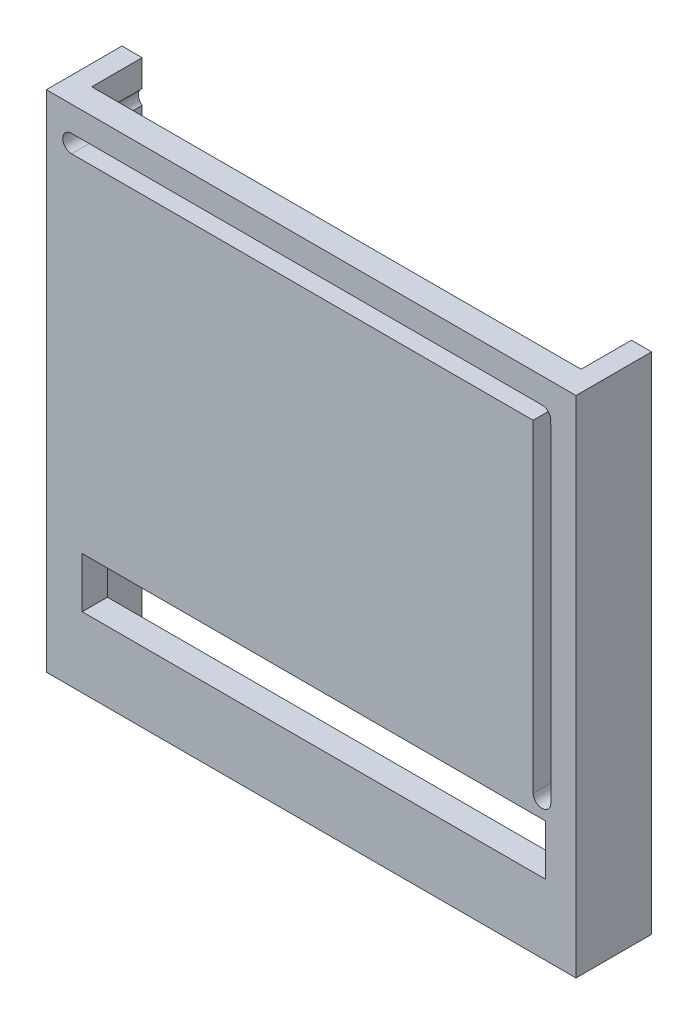
ISO-10303-21;
HEADER;
FILE_DESCRIPTION(('STEP AP214'),'2;1');
FILE_NAME('part.step','',(''),(''),'','','');
FILE_SCHEMA(('AUTOMOTIVE_DESIGN { 1 0 10303 214 1 1 1 1 }'));
ENDSEC;
DATA;
#1=APPLICATION_CONTEXT('core data for automotive mechanical design processes');
#2=APPLICATION_PROTOCOL_DEFINITION('international standard','automotive_design',2000,#1);
#3=PRODUCT_CONTEXT('',#1,'mechanical');
#4=PRODUCT('Part','Part','',(#3));
#5=PRODUCT_RELATED_PRODUCT_CATEGORY('part','',(#4));
#6=PRODUCT_DEFINITION_FORMATION('','',#4);
#7=PRODUCT_DEFINITION_CONTEXT('part definition',#1,'design');
#8=PRODUCT_DEFINITION('design','',#6,#7);
#9=PRODUCT_DEFINITION_SHAPE('','',#8);
#10=(LENGTH_UNIT() NAMED_UNIT(*) SI_UNIT(.MILLI.,.METRE.));
#11=(NAMED_UNIT(*) PLANE_ANGLE_UNIT() SI_UNIT($,.RADIAN.));
#12=(NAMED_UNIT(*) SI_UNIT($,.STERADIAN.) SOLID_ANGLE_UNIT());
#13=UNCERTAINTY_MEASURE_WITH_UNIT(LENGTH_MEASURE(1.E-05),#10,'distance_accuracy_value','');
#14=(GEOMETRIC_REPRESENTATION_CONTEXT(3) GLOBAL_UNCERTAINTY_ASSIGNED_CONTEXT((#13)) GLOBAL_UNIT_ASSIGNED_CONTEXT((#10,
#11,#12)) REPRESENTATION_CONTEXT('',''));
#15=CARTESIAN_POINT('',(0.,0.,0.));
#16=DIRECTION('',(0.,0.,1.));
#17=DIRECTION('',(1.,0.,0.));
#18=AXIS2_PLACEMENT_3D('',#15,#16,#17);
#19=CARTESIAN_POINT('',(-97.,100.,0.));
#20=DIRECTION('',(-1.,0.,0.));
#21=DIRECTION('',(0.,0.,1.));
#22=AXIS2_PLACEMENT_3D('',#19,#20,#21);
#23=PLANE('',#22);
#24=DIRECTION('',(0.,-1.,0.));
#25=VECTOR('',#24,1.);
#26=CARTESIAN_POINT('',(-97.,100.,0.));
#27=LINE('',#26,#25);
#28=CARTESIAN_POINT('',(-97.,83.627718676731,0.));
#29=VERTEX_POINT('',#28);
#30=CARTESIAN_POINT('',(-97.,-100.,0.));
#31=VERTEX_POINT('',#30);
#32=EDGE_CURVE('E351',#29,#31,#27,.T.);
#33=ORIENTED_EDGE('',*,*,#32,.F.);
#34=DIRECTION('',(0.,0.,1.));
#35=VECTOR('',#34,1.);
#36=CARTESIAN_POINT('',(-97.,83.627718676731,0.));
#37=LINE('',#36,#35);
#38=CARTESIAN_POINT('',(-97.,83.627718676731,20.));
#39=VERTEX_POINT('',#38);
#40=EDGE_CURVE('E302',#29,#39,#37,.T.);
#41=ORIENTED_EDGE('',*,*,#40,.T.);
#42=DIRECTION('',(0.,-1.,0.));
#43=VECTOR('',#42,1.);
#44=CARTESIAN_POINT('',(-97.,100.,20.));
#45=LINE('',#44,#43);
#46=CARTESIAN_POINT('',(-97.,-100.,20.));
#47=VERTEX_POINT('',#46);
#48=EDGE_CURVE('E355',#39,#47,#45,.T.);
#49=ORIENTED_EDGE('',*,*,#48,.T.);
#50=DIRECTION('',(0.,0.,-1.));
#51=VECTOR('',#50,1.);
#52=CARTESIAN_POINT('',(-97.,-100.,0.));
#53=LINE('',#52,#51);
#54=EDGE_CURVE('E331',#47,#31,#53,.T.);
#55=ORIENTED_EDGE('',*,*,#54,.T.);
#56=EDGE_LOOP('',(#33,#41,#49,#55));
#57=FACE_BOUND('',#56,.T.);
#58=ADVANCED_FACE('F35',(#57),#23,.F.);
#59=CARTESIAN_POINT('',(0.,0.,0.));
#60=DIRECTION('',(0.,0.,-1.));
#61=DIRECTION('',(-1.,0.,0.));
#62=AXIS2_PLACEMENT_3D('',#59,#60,#61);
#63=PLANE('',#62);
#64=DIRECTION('',(0.,-1.,0.));
#65=VECTOR('',#64,1.);
#66=CARTESIAN_POINT('',(97.,100.,0.));
#67=LINE('',#66,#65);
#68=CARTESIAN_POINT('',(97.,100.,0.));
#69=VERTEX_POINT('',#68);
#70=CARTESIAN_POINT('',(97.,-100.,0.));
#71=VERTEX_POINT('',#70);
#72=EDGE_CURVE('E345',#69,#71,#67,.T.);
#73=ORIENTED_EDGE('',*,*,#72,.F.);
#74=DIRECTION('',(-1.,0.,0.));
#75=VECTOR('',#74,1.);
#76=CARTESIAN_POINT('',(-105.,100.,0.));
#77=LINE('',#76,#75);
#78=CARTESIAN_POINT('',(105.,100.,0.));
#79=VERTEX_POINT('',#78);
#80=EDGE_CURVE('E371',#79,#69,#77,.T.);
#81=ORIENTED_EDGE('',*,*,#80,.F.);
#82=DIRECTION('',(0.,1.,0.));
#83=VECTOR('',#82,1.);
#84=CARTESIAN_POINT('',(105.,-100.,0.));
#85=LINE('',#84,#83);
#86=CARTESIAN_POINT('',(105.,-100.,0.));
#87=VERTEX_POINT('',#86);
#88=EDGE_CURVE('E347',#87,#79,#85,.T.);
#89=ORIENTED_EDGE('',*,*,#88,.F.);
#90=DIRECTION('',(1.,0.,0.));
#91=VECTOR('',#90,1.);
#92=CARTESIAN_POINT('',(-105.,-100.,0.));
#93=LINE('',#92,#91);
#94=EDGE_CURVE('E376',#71,#87,#93,.T.);
#95=ORIENTED_EDGE('',*,*,#94,.F.);
#96=EDGE_LOOP('',(#73,#81,#89,#95));
#97=FACE_BOUND('',#96,.T.);
#98=ADVANCED_FACE('F475',(#97),#63,.T.);
#99=CARTESIAN_POINT('',(105.,-100.,30.));
#100=DIRECTION('',(-1.,0.,0.));
#101=DIRECTION('',(0.,0.,1.));
#102=AXIS2_PLACEMENT_3D('',#99,#100,#101);
#103=PLANE('',#102);
#104=ORIENTED_EDGE('',*,*,#88,.T.);
#105=DIRECTION('',(0.,0.,-1.));
#106=VECTOR('',#105,1.);
#107=CARTESIAN_POINT('',(105.,100.,30.));
#108=LINE('',#107,#106);
#109=CARTESIAN_POINT('',(105.,100.,30.));
#110=VERTEX_POINT('',#109);
#111=EDGE_CURVE('E387',#110,#79,#108,.T.);
#112=ORIENTED_EDGE('',*,*,#111,.F.);
#113=DIRECTION('',(0.,1.,0.));
#114=VECTOR('',#113,1.);
#115=CARTESIAN_POINT('',(105.,-100.,30.));
#116=LINE('',#115,#114);
#117=CARTESIAN_POINT('',(105.,-100.,30.));
#118=VERTEX_POINT('',#117);
#119=EDGE_CURVE('E357',#118,#110,#116,.T.);
#120=ORIENTED_EDGE('',*,*,#119,.F.);
#121=DIRECTION('',(0.,0.,-1.));
#122=VECTOR('',#121,1.);
#123=CARTESIAN_POINT('',(105.,-100.,30.));
#124=LINE('',#123,#122);
#125=EDGE_CURVE('E367',#118,#87,#124,.T.);
#126=ORIENTED_EDGE('',*,*,#125,.T.);
#127=EDGE_LOOP('',(#104,#112,#120,#126));
#128=FACE_BOUND('',#127,.T.);
#129=ADVANCED_FACE('F37',(#128),#103,.F.);
#130=CARTESIAN_POINT('',(-105.,100.,30.));
#131=DIRECTION('',(0.,-1.,0.));
#132=DIRECTION('',(0.,0.,-1.));
#133=AXIS2_PLACEMENT_3D('',#130,#131,#132);
#134=PLANE('',#133);
#135=ORIENTED_EDGE('',*,*,#80,.T.);
#136=DIRECTION('',(0.,0.,1.));
#137=VECTOR('',#136,1.);
#138=CARTESIAN_POINT('',(97.,100.,0.));
#139=LINE('',#138,#137);
#140=CARTESIAN_POINT('',(97.,100.,20.));
#141=VERTEX_POINT('',#140);
#142=EDGE_CURVE('E327',#69,#141,#139,.T.);
#143=ORIENTED_EDGE('',*,*,#142,.T.);
#144=DIRECTION('',(-1.,0.,0.));
#145=VECTOR('',#144,1.);
#146=CARTESIAN_POINT('',(-97.,100.,20.));
#147=LINE('',#146,#145);
#148=CARTESIAN_POINT('',(-97.,100.,20.));
#149=VERTEX_POINT('',#148);
#150=EDGE_CURVE('E330',#141,#149,#147,.T.);
#151=ORIENTED_EDGE('',*,*,#150,.T.);
#152=DIRECTION('',(0.,0.,-1.));
#153=VECTOR('',#152,1.);
#154=CARTESIAN_POINT('',(-97.,100.,0.));
#155=LINE('',#154,#153);
#156=CARTESIAN_POINT('',(-97.,100.,0.));
#157=VERTEX_POINT('',#156);
#158=EDGE_CURVE('E334',#149,#157,#155,.T.);
#159=ORIENTED_EDGE('',*,*,#158,.T.);
#160=CARTESIAN_POINT('',(-105.,100.,0.));
#161=VERTEX_POINT('',#160);
#162=EDGE_CURVE('E370',#157,#161,#77,.T.);
#163=ORIENTED_EDGE('',*,*,#162,.T.);
#164=DIRECTION('',(0.,0.,-1.));
#165=VECTOR('',#164,1.);
#166=CARTESIAN_POINT('',(-105.,100.,30.));
#167=LINE('',#166,#165);
#168=CARTESIAN_POINT('',(-105.,100.,30.));
#169=VERTEX_POINT('',#168);
#170=EDGE_CURVE('E384',#169,#161,#167,.T.);
#171=ORIENTED_EDGE('',*,*,#170,.F.);
#172=DIRECTION('',(-1.,0.,0.));
#173=VECTOR('',#172,1.);
#174=CARTESIAN_POINT('',(-105.,100.,30.));
#175=LINE('',#174,#173);
#176=EDGE_CURVE('E360',#110,#169,#175,.T.);
#177=ORIENTED_EDGE('',*,*,#176,.F.);
#178=ORIENTED_EDGE('',*,*,#111,.T.);
#179=EDGE_LOOP('',(#135,#143,#151,#159,#163,#171,#177,#178));
#180=FACE_BOUND('',#179,.T.);
#181=ADVANCED_FACE('F419',(#180),#134,.F.);
#182=CARTESIAN_POINT('',(-105.,-100.,30.));
#183=DIRECTION('',(1.,0.,0.));
#184=DIRECTION('',(0.,0.,-1.));
#185=AXIS2_PLACEMENT_3D('',#182,#183,#184);
#186=PLANE('',#185);
#187=DIRECTION('',(0.,-1.,0.));
#188=VECTOR('',#187,1.);
#189=CARTESIAN_POINT('',(-105.,-100.,0.));
#190=LINE('',#189,#188);
#191=CARTESIAN_POINT('',(-105.,-100.,0.));
#192=VERTEX_POINT('',#191);
#193=EDGE_CURVE('E374',#161,#192,#190,.T.);
#194=ORIENTED_EDGE('',*,*,#193,.T.);
#195=DIRECTION('',(0.,0.,-1.));
#196=VECTOR('',#195,1.);
#197=CARTESIAN_POINT('',(-105.,-100.,30.));
#198=LINE('',#197,#196);
#199=CARTESIAN_POINT('',(-105.,-100.,30.));
#200=VERTEX_POINT('',#199);
#201=EDGE_CURVE('E381',#200,#192,#198,.T.);
#202=ORIENTED_EDGE('',*,*,#201,.F.);
#203=DIRECTION('',(0.,-1.,0.));
#204=VECTOR('',#203,1.);
#205=CARTESIAN_POINT('',(-105.,-100.,30.));
#206=LINE('',#205,#204);
#207=EDGE_CURVE('E363',#169,#200,#206,.T.);
#208=ORIENTED_EDGE('',*,*,#207,.F.);
#209=ORIENTED_EDGE('',*,*,#170,.T.);
#210=EDGE_LOOP('',(#194,#202,#208,#209));
#211=FACE_BOUND('',#210,.T.);
#212=ADVANCED_FACE('F502',(#211),#186,.F.);
#213=CARTESIAN_POINT('',(-105.,-100.,30.));
#214=DIRECTION('',(0.,1.,0.));
#215=DIRECTION('',(0.,0.,1.));
#216=AXIS2_PLACEMENT_3D('',#213,#214,#215);
#217=PLANE('',#216);
#218=DIRECTION('',(1.,0.,0.));
#219=VECTOR('',#218,1.);
#220=CARTESIAN_POINT('',(-90.,-100.,22.));
#221=LINE('',#220,#219);
#222=CARTESIAN_POINT('',(-90.,-100.,22.));
#223=VERTEX_POINT('',#222);
#224=CARTESIAN_POINT('',(90.,-100.,22.));
#225=VERTEX_POINT('',#224);
#226=EDGE_CURVE('E237',#223,#225,#221,.T.);
#227=ORIENTED_EDGE('',*,*,#226,.F.);
#228=CARTESIAN_POINT('',(-90.,-100.,24.5));
#229=DIRECTION('',(0.,-1.,0.));
#230=DIRECTION('',(0.,0.,-1.));
#231=AXIS2_PLACEMENT_3D('',#228,#229,#230);
#232=CIRCLE('',#231,2.5);
#233=CARTESIAN_POINT('',(-90.,-100.,27.));
#234=VERTEX_POINT('',#233);
#235=EDGE_CURVE('E50',#234,#223,#232,.T.);
#236=ORIENTED_EDGE('',*,*,#235,.F.);
#237=DIRECTION('',(-1.,0.,0.));
#238=VECTOR('',#237,1.);
#239=CARTESIAN_POINT('',(-90.,-100.,27.));
#240=LINE('',#239,#238);
#241=CARTESIAN_POINT('',(90.,-100.,27.));
#242=VERTEX_POINT('',#241);
#243=EDGE_CURVE('E228',#242,#234,#240,.T.);
#244=ORIENTED_EDGE('',*,*,#243,.F.);
#245=CARTESIAN_POINT('',(90.,-100.,24.5));
#246=DIRECTION('',(0.,-1.,0.));
#247=DIRECTION('',(0.,0.,1.));
#248=AXIS2_PLACEMENT_3D('',#245,#246,#247);
#249=CIRCLE('',#248,2.5);
#250=EDGE_CURVE('E231',#225,#242,#249,.T.);
#251=ORIENTED_EDGE('',*,*,#250,.F.);
#252=EDGE_LOOP('',(#227,#236,#244,#251));
#253=FACE_BOUND('',#252,.T.);
#254=DIRECTION('',(-1.,0.,0.));
#255=VECTOR('',#254,1.);
#256=CARTESIAN_POINT('',(-97.,-100.,20.));
#257=LINE('',#256,#255);
#258=CARTESIAN_POINT('',(97.,-100.,20.));
#259=VERTEX_POINT('',#258);
#260=EDGE_CURVE('E340',#259,#47,#257,.T.);
#261=ORIENTED_EDGE('',*,*,#260,.F.);
#262=DIRECTION('',(0.,0.,1.));
#263=VECTOR('',#262,1.);
#264=CARTESIAN_POINT('',(97.,-100.,0.));
#265=LINE('',#264,#263);
#266=EDGE_CURVE('E322',#71,#259,#265,.T.);
#267=ORIENTED_EDGE('',*,*,#266,.F.);
#268=ORIENTED_EDGE('',*,*,#94,.T.);
#269=ORIENTED_EDGE('',*,*,#125,.F.);
#270=DIRECTION('',(1.,0.,0.));
#271=VECTOR('',#270,1.);
#272=CARTESIAN_POINT('',(-105.,-100.,30.));
#273=LINE('',#272,#271);
#274=EDGE_CURVE('E365',#200,#118,#273,.T.);
#275=ORIENTED_EDGE('',*,*,#274,.F.);
#276=ORIENTED_EDGE('',*,*,#201,.T.);
#277=EDGE_CURVE('E361',#192,#31,#93,.T.);
#278=ORIENTED_EDGE('',*,*,#277,.T.);
#279=ORIENTED_EDGE('',*,*,#54,.F.);
#280=EDGE_LOOP('',(#261,#267,#268,#269,#275,#276,#278,#279));
#281=FACE_BOUND('',#280,.T.);
#282=ADVANCED_FACE('F429',(#253,#281),#217,.F.);
#283=CARTESIAN_POINT('',(0.,0.,30.));
#284=DIRECTION('',(0.,0.,-1.));
#285=DIRECTION('',(-1.,0.,0.));
#286=AXIS2_PLACEMENT_3D('',#283,#284,#285);
#287=PLANE('',#286);
#288=DIRECTION('',(-1.,0.,0.));
#289=VECTOR('',#288,1.);
#290=CARTESIAN_POINT('',(-90.7668114843783,-72.1389858976709,30.));
#291=LINE('',#290,#289);
#292=CARTESIAN_POINT('',(92.9321495815816,-72.1389858976709,30.));
#293=VERTEX_POINT('',#292);
#294=CARTESIAN_POINT('',(-90.7668114843783,-72.1389858976709,30.));
#295=VERTEX_POINT('',#294);
#296=EDGE_CURVE('E255',#293,#295,#291,.T.);
#297=ORIENTED_EDGE('',*,*,#296,.T.);
#298=DIRECTION('',(0.,1.,0.));
#299=VECTOR('',#298,1.);
#300=CARTESIAN_POINT('',(-90.7668114843783,-72.1389858976709,30.));
#301=LINE('',#300,#299);
#302=CARTESIAN_POINT('',(-90.7668114843783,-52.1389858976708,30.));
#303=VERTEX_POINT('',#302);
#304=EDGE_CURVE('E247',#295,#303,#301,.T.);
#305=ORIENTED_EDGE('',*,*,#304,.T.);
#306=DIRECTION('',(1.,0.,0.));
#307=VECTOR('',#306,1.);
#308=CARTESIAN_POINT('',(-90.7668114843783,-52.1389858976708,30.));
#309=LINE('',#308,#307);
#310=CARTESIAN_POINT('',(92.9321495815816,-52.1389858976709,30.));
#311=VERTEX_POINT('',#310);
#312=EDGE_CURVE('E250',#303,#311,#309,.T.);
#313=ORIENTED_EDGE('',*,*,#312,.T.);
#314=DIRECTION('',(0.,-1.,0.));
#315=VECTOR('',#314,1.);
#316=CARTESIAN_POINT('',(92.9321495815816,-72.1389858976709,30.));
#317=LINE('',#316,#315);
#318=EDGE_CURVE('E58',#311,#293,#317,.T.);
#319=ORIENTED_EDGE('',*,*,#318,.T.);
#320=EDGE_LOOP('',(#297,#305,#313,#319));
#321=FACE_BOUND('',#320,.T.);
#322=DIRECTION('',(-1.,0.,0.));
#323=VECTOR('',#322,1.);
#324=CARTESIAN_POINT('',(91.5,90.,30.));
#325=LINE('',#324,#323);
#326=CARTESIAN_POINT('',(91.5,90.,30.));
#327=VERTEX_POINT('',#326);
#328=CARTESIAN_POINT('',(-95.,90.,30.));
#329=VERTEX_POINT('',#328);
#330=EDGE_CURVE('E284',#327,#329,#325,.T.);
#331=ORIENTED_EDGE('',*,*,#330,.F.);
#332=CARTESIAN_POINT('',(91.5,86.5,30.));
#333=DIRECTION('',(0.,0.,1.));
#334=DIRECTION('',(1.,0.,0.));
#335=AXIS2_PLACEMENT_3D('',#332,#333,#334);
#336=CIRCLE('',#335,3.5);
#337=CARTESIAN_POINT('',(94.9186985827943,85.75,30.));
#338=VERTEX_POINT('',#337);
#339=EDGE_CURVE('E270',#338,#327,#336,.T.);
#340=ORIENTED_EDGE('',*,*,#339,.F.);
#341=CARTESIAN_POINT('',(91.5,85.,30.));
#342=DIRECTION('',(0.,0.,1.));
#343=DIRECTION('',(1.,0.,0.));
#344=AXIS2_PLACEMENT_3D('',#341,#342,#343);
#345=CIRCLE('',#344,3.50000000000002);
#346=CARTESIAN_POINT('',(95.,85.,30.));
#347=VERTEX_POINT('',#346);
#348=EDGE_CURVE('E308',#347,#338,#345,.T.);
#349=ORIENTED_EDGE('',*,*,#348,.F.);
#350=DIRECTION('',(0.,1.,0.));
#351=VECTOR('',#350,1.);
#352=CARTESIAN_POINT('',(95.,85.,30.));
#353=LINE('',#352,#351);
#354=CARTESIAN_POINT('',(95.,-45.,30.));
#355=VERTEX_POINT('',#354);
#356=EDGE_CURVE('E316',#355,#347,#353,.T.);
#357=ORIENTED_EDGE('',*,*,#356,.F.);
#358=CARTESIAN_POINT('',(91.5,-45.,30.));
#359=DIRECTION('',(0.,0.,1.));
#360=DIRECTION('',(-1.,0.,0.));
#361=AXIS2_PLACEMENT_3D('',#358,#359,#360);
#362=CIRCLE('',#361,3.50000000000002);
#363=CARTESIAN_POINT('',(88.,-45.,30.));
#364=VERTEX_POINT('',#363);
#365=EDGE_CURVE('E313',#364,#355,#362,.T.);
#366=ORIENTED_EDGE('',*,*,#365,.F.);
#367=DIRECTION('',(0.,-1.,0.));
#368=VECTOR('',#367,1.);
#369=CARTESIAN_POINT('',(88.,85.,30.));
#370=LINE('',#369,#368);
#371=CARTESIAN_POINT('',(88.,83.,30.));
#372=VERTEX_POINT('',#371);
#373=EDGE_CURVE('E311',#372,#364,#370,.T.);
#374=ORIENTED_EDGE('',*,*,#373,.F.);
#375=DIRECTION('',(1.,0.,0.));
#376=VECTOR('',#375,1.);
#377=CARTESIAN_POINT('',(91.5,83.,30.));
#378=LINE('',#377,#376);
#379=CARTESIAN_POINT('',(-95.,83.,30.));
#380=VERTEX_POINT('',#379);
#381=EDGE_CURVE('E281',#380,#372,#378,.T.);
#382=ORIENTED_EDGE('',*,*,#381,.F.);
#383=CARTESIAN_POINT('',(-95.,86.5,30.));
#384=DIRECTION('',(0.,0.,1.));
#385=DIRECTION('',(-1.,0.,0.));
#386=AXIS2_PLACEMENT_3D('',#383,#384,#385);
#387=CIRCLE('',#386,3.49999999999999);
#388=EDGE_CURVE('E287',#329,#380,#387,.T.);
#389=ORIENTED_EDGE('',*,*,#388,.F.);
#390=EDGE_LOOP('',(#331,#340,#349,#357,#366,#374,#382,#389));
#391=FACE_BOUND('',#390,.T.);
#392=ORIENTED_EDGE('',*,*,#119,.T.);
#393=ORIENTED_EDGE('',*,*,#176,.T.);
#394=ORIENTED_EDGE('',*,*,#207,.T.);
#395=ORIENTED_EDGE('',*,*,#274,.T.);
#396=EDGE_LOOP('',(#392,#393,#394,#395));
#397=FACE_BOUND('',#396,.T.);
#398=ADVANCED_FACE('F447',(#321,#391,#397),#287,.F.);
#399=CARTESIAN_POINT('',(-95.,86.5,0.));
#400=DIRECTION('',(0.,0.,1.));
#401=DIRECTION('',(-1.,0.,0.));
#402=AXIS2_PLACEMENT_3D('',#399,#400,#401);
#403=CIRCLE('',#402,3.49999999999999);
#404=CARTESIAN_POINT('',(-97.,89.372281323269,0.));
#405=VERTEX_POINT('',#404);
#406=EDGE_CURVE('E277',#405,#29,#403,.T.);
#407=ORIENTED_EDGE('',*,*,#406,.T.);
#408=ORIENTED_EDGE('',*,*,#32,.T.);
#409=ORIENTED_EDGE('',*,*,#277,.F.);
#410=ORIENTED_EDGE('',*,*,#193,.F.);
#411=ORIENTED_EDGE('',*,*,#162,.F.);
#412=EDGE_CURVE('E348',#157,#405,#27,.T.);
#413=ORIENTED_EDGE('',*,*,#412,.T.);
#414=EDGE_LOOP('',(#407,#408,#409,#410,#411,#413));
#415=FACE_BOUND('',#414,.T.);
#416=ADVANCED_FACE('F482',(#415),#63,.T.);
#417=CARTESIAN_POINT('',(97.,100.,0.));
#418=DIRECTION('',(1.,0.,0.));
#419=DIRECTION('',(0.,0.,-1.));
#420=AXIS2_PLACEMENT_3D('',#417,#418,#419);
#421=PLANE('',#420);
#422=ORIENTED_EDGE('',*,*,#266,.T.);
#423=DIRECTION('',(0.,-1.,0.));
#424=VECTOR('',#423,1.);
#425=CARTESIAN_POINT('',(97.,100.,20.));
#426=LINE('',#425,#424);
#427=EDGE_CURVE('E337',#141,#259,#426,.T.);
#428=ORIENTED_EDGE('',*,*,#427,.F.);
#429=ORIENTED_EDGE('',*,*,#142,.F.);
#430=ORIENTED_EDGE('',*,*,#72,.T.);
#431=EDGE_LOOP('',(#422,#428,#429,#430));
#432=FACE_BOUND('',#431,.T.);
#433=ADVANCED_FACE('F425',(#432),#421,.F.);
#434=CARTESIAN_POINT('',(-97.,89.372281323269,20.));
#435=VERTEX_POINT('',#434);
#436=EDGE_CURVE('E352',#149,#435,#45,.T.);
#437=ORIENTED_EDGE('',*,*,#436,.T.);
#438=DIRECTION('',(0.,0.,1.));
#439=VECTOR('',#438,1.);
#440=CARTESIAN_POINT('',(-97.,89.372281323269,0.));
#441=LINE('',#440,#439);
#442=EDGE_CURVE('E305',#435,#405,#441,.F.);
#443=ORIENTED_EDGE('',*,*,#442,.T.);
#444=ORIENTED_EDGE('',*,*,#412,.F.);
#445=ORIENTED_EDGE('',*,*,#158,.F.);
#446=EDGE_LOOP('',(#437,#443,#444,#445));
#447=FACE_BOUND('',#446,.T.);
#448=ADVANCED_FACE('F416',(#447),#23,.F.);
#449=CARTESIAN_POINT('',(-97.,100.,20.));
#450=DIRECTION('',(0.,0.,1.));
#451=DIRECTION('',(1.,0.,0.));
#452=AXIS2_PLACEMENT_3D('',#449,#450,#451);
#453=PLANE('',#452);
#454=DIRECTION('',(1.,0.,0.));
#455=VECTOR('',#454,1.);
#456=CARTESIAN_POINT('',(-90.7668114843783,-52.1389858976708,20.));
#457=LINE('',#456,#455);
#458=CARTESIAN_POINT('',(-90.7668114843783,-52.1389858976708,20.));
#459=VERTEX_POINT('',#458);
#460=CARTESIAN_POINT('',(92.9321495815816,-52.1389858976709,20.));
#461=VERTEX_POINT('',#460);
#462=EDGE_CURVE('E260',#459,#461,#457,.T.);
#463=ORIENTED_EDGE('',*,*,#462,.F.);
#464=DIRECTION('',(0.,1.,0.));
#465=VECTOR('',#464,1.);
#466=CARTESIAN_POINT('',(-90.7668114843783,-72.1389858976709,20.));
#467=LINE('',#466,#465);
#468=CARTESIAN_POINT('',(-90.7668114843783,-72.1389858976709,20.));
#469=VERTEX_POINT('',#468);
#470=EDGE_CURVE('E243',#469,#459,#467,.T.);
#471=ORIENTED_EDGE('',*,*,#470,.F.);
#472=DIRECTION('',(-1.,0.,0.));
#473=VECTOR('',#472,1.);
#474=CARTESIAN_POINT('',(-90.7668114843783,-72.1389858976709,20.));
#475=LINE('',#474,#473);
#476=CARTESIAN_POINT('',(92.9321495815816,-72.1389858976709,20.));
#477=VERTEX_POINT('',#476);
#478=EDGE_CURVE('E251',#477,#469,#475,.T.);
#479=ORIENTED_EDGE('',*,*,#478,.F.);
#480=DIRECTION('',(0.,-1.,0.));
#481=VECTOR('',#480,1.);
#482=CARTESIAN_POINT('',(92.9321495815816,-72.1389858976709,20.));
#483=LINE('',#482,#481);
#484=EDGE_CURVE('E263',#461,#477,#483,.T.);
#485=ORIENTED_EDGE('',*,*,#484,.F.);
#486=EDGE_LOOP('',(#463,#471,#479,#485));
#487=FACE_BOUND('',#486,.T.);
#488=CARTESIAN_POINT('',(-95.,86.5,20.));
#489=DIRECTION('',(0.,0.,1.));
#490=DIRECTION('',(1.,0.,0.));
#491=AXIS2_PLACEMENT_3D('',#488,#489,#490);
#492=CIRCLE('',#491,3.49999999999999);
#493=CARTESIAN_POINT('',(-95.,83.,20.));
#494=VERTEX_POINT('',#493);
#495=EDGE_CURVE('E11',#39,#494,#492,.T.);
#496=ORIENTED_EDGE('',*,*,#495,.T.);
#497=DIRECTION('',(1.,0.,0.));
#498=VECTOR('',#497,1.);
#499=CARTESIAN_POINT('',(-97.,83.,20.));
#500=LINE('',#499,#498);
#501=CARTESIAN_POINT('',(88.,83.,20.));
#502=VERTEX_POINT('',#501);
#503=EDGE_CURVE('E293',#494,#502,#500,.T.);
#504=ORIENTED_EDGE('',*,*,#503,.T.);
#505=DIRECTION('',(0.,-1.,0.));
#506=VECTOR('',#505,1.);
#507=CARTESIAN_POINT('',(88.,100.,20.));
#508=LINE('',#507,#506);
#509=CARTESIAN_POINT('',(88.,-45.,20.));
#510=VERTEX_POINT('',#509);
#511=EDGE_CURVE('E390',#502,#510,#508,.T.);
#512=ORIENTED_EDGE('',*,*,#511,.T.);
#513=CARTESIAN_POINT('',(91.5,-45.,20.));
#514=DIRECTION('',(0.,0.,1.));
#515=DIRECTION('',(1.,0.,0.));
#516=AXIS2_PLACEMENT_3D('',#513,#514,#515);
#517=CIRCLE('',#516,3.50000000000002);
#518=CARTESIAN_POINT('',(95.,-45.,20.));
#519=VERTEX_POINT('',#518);
#520=EDGE_CURVE('E392',#510,#519,#517,.T.);
#521=ORIENTED_EDGE('',*,*,#520,.T.);
#522=DIRECTION('',(0.,1.,0.));
#523=VECTOR('',#522,1.);
#524=CARTESIAN_POINT('',(95.,100.,20.));
#525=LINE('',#524,#523);
#526=CARTESIAN_POINT('',(95.,85.,20.));
#527=VERTEX_POINT('',#526);
#528=EDGE_CURVE('E395',#519,#527,#525,.T.);
#529=ORIENTED_EDGE('',*,*,#528,.T.);
#530=CARTESIAN_POINT('',(91.5,85.,20.));
#531=DIRECTION('',(0.,0.,1.));
#532=DIRECTION('',(1.,0.,0.));
#533=AXIS2_PLACEMENT_3D('',#530,#531,#532);
#534=CIRCLE('',#533,3.50000000000002);
#535=CARTESIAN_POINT('',(94.9186985827943,85.75,20.));
#536=VERTEX_POINT('',#535);
#537=EDGE_CURVE('E398',#527,#536,#534,.T.);
#538=ORIENTED_EDGE('',*,*,#537,.T.);
#539=CARTESIAN_POINT('',(91.5,86.5,20.));
#540=DIRECTION('',(0.,0.,1.));
#541=DIRECTION('',(1.,0.,0.));
#542=AXIS2_PLACEMENT_3D('',#539,#540,#541);
#543=CIRCLE('',#542,3.5);
#544=CARTESIAN_POINT('',(91.5,90.,20.));
#545=VERTEX_POINT('',#544);
#546=EDGE_CURVE('E299',#536,#545,#543,.T.);
#547=ORIENTED_EDGE('',*,*,#546,.T.);
#548=DIRECTION('',(-1.,0.,0.));
#549=VECTOR('',#548,1.);
#550=CARTESIAN_POINT('',(-97.,90.,20.));
#551=LINE('',#550,#549);
#552=CARTESIAN_POINT('',(-95.,90.,20.));
#553=VERTEX_POINT('',#552);
#554=EDGE_CURVE('E406',#545,#553,#551,.T.);
#555=ORIENTED_EDGE('',*,*,#554,.T.);
#556=EDGE_CURVE('E39',#553,#435,#492,.T.);
#557=ORIENTED_EDGE('',*,*,#556,.T.);
#558=ORIENTED_EDGE('',*,*,#436,.F.);
#559=ORIENTED_EDGE('',*,*,#150,.F.);
#560=ORIENTED_EDGE('',*,*,#427,.T.);
#561=ORIENTED_EDGE('',*,*,#260,.T.);
#562=ORIENTED_EDGE('',*,*,#48,.F.);
#563=EDGE_LOOP('',(#496,#504,#512,#521,#529,#538,#547,#555,#557,#558,#559,#560,#561,#562));
#564=FACE_BOUND('',#563,.T.);
#565=ADVANCED_FACE('F410',(#487,#564),#453,.F.);
#566=CARTESIAN_POINT('',(91.5,85.,0.));
#567=DIRECTION('',(0.,0.,1.));
#568=DIRECTION('',(1.,0.,0.));
#569=AXIS2_PLACEMENT_3D('',#566,#567,#568);
#570=CYLINDRICAL_SURFACE('',#569,3.50000000000002);
#571=ORIENTED_EDGE('',*,*,#348,.T.);
#572=DIRECTION('',(0.,0.,1.));
#573=VECTOR('',#572,1.);
#574=CARTESIAN_POINT('',(94.9186985827943,85.75,15.));
#575=LINE('',#574,#573);
#576=EDGE_CURVE('E404',#338,#536,#575,.F.);
#577=ORIENTED_EDGE('',*,*,#576,.T.);
#578=ORIENTED_EDGE('',*,*,#537,.F.);
#579=DIRECTION('',(0.,0.,1.));
#580=VECTOR('',#579,1.);
#581=CARTESIAN_POINT('',(95.,85.,0.));
#582=LINE('',#581,#580);
#583=EDGE_CURVE('E320',#527,#347,#582,.T.);
#584=ORIENTED_EDGE('',*,*,#583,.T.);
#585=EDGE_LOOP('',(#571,#577,#578,#584));
#586=FACE_BOUND('',#585,.T.);
#587=ADVANCED_FACE('F459',(#586),#570,.F.);
#588=CARTESIAN_POINT('',(95.,85.,0.));
#589=DIRECTION('',(1.,0.,0.));
#590=DIRECTION('',(0.,1.,0.));
#591=AXIS2_PLACEMENT_3D('',#588,#589,#590);
#592=PLANE('',#591);
#593=DIRECTION('',(0.,0.,1.));
#594=VECTOR('',#593,1.);
#595=CARTESIAN_POINT('',(95.,-45.,0.));
#596=LINE('',#595,#594);
#597=EDGE_CURVE('E323',#519,#355,#596,.T.);
#598=ORIENTED_EDGE('',*,*,#597,.T.);
#599=ORIENTED_EDGE('',*,*,#356,.T.);
#600=ORIENTED_EDGE('',*,*,#583,.F.);
#601=ORIENTED_EDGE('',*,*,#528,.F.);
#602=EDGE_LOOP('',(#598,#599,#600,#601));
#603=FACE_BOUND('',#602,.T.);
#604=ADVANCED_FACE('F457',(#603),#592,.F.);
#605=CARTESIAN_POINT('',(91.5,-45.,0.));
#606=DIRECTION('',(0.,0.,1.));
#607=DIRECTION('',(1.,0.,0.));
#608=AXIS2_PLACEMENT_3D('',#605,#606,#607);
#609=CYLINDRICAL_SURFACE('',#608,3.50000000000002);
#610=DIRECTION('',(0.,0.,1.));
#611=VECTOR('',#610,1.);
#612=CARTESIAN_POINT('',(88.,-45.,0.));
#613=LINE('',#612,#611);
#614=EDGE_CURVE('E319',#510,#364,#613,.T.);
#615=ORIENTED_EDGE('',*,*,#614,.T.);
#616=ORIENTED_EDGE('',*,*,#365,.T.);
#617=ORIENTED_EDGE('',*,*,#597,.F.);
#618=ORIENTED_EDGE('',*,*,#520,.F.);
#619=EDGE_LOOP('',(#615,#616,#617,#618));
#620=FACE_BOUND('',#619,.T.);
#621=ADVANCED_FACE('F453',(#620),#609,.F.);
#622=CARTESIAN_POINT('',(88.,85.,0.));
#623=DIRECTION('',(-1.,0.,0.));
#624=DIRECTION('',(0.,-1.,0.));
#625=AXIS2_PLACEMENT_3D('',#622,#623,#624);
#626=PLANE('',#625);
#627=ORIENTED_EDGE('',*,*,#511,.F.);
#628=DIRECTION('',(0.,0.,1.));
#629=VECTOR('',#628,1.);
#630=CARTESIAN_POINT('',(88.,83.,0.));
#631=LINE('',#630,#629);
#632=EDGE_CURVE('E401',#502,#372,#631,.T.);
#633=ORIENTED_EDGE('',*,*,#632,.T.);
#634=ORIENTED_EDGE('',*,*,#373,.T.);
#635=ORIENTED_EDGE('',*,*,#614,.F.);
#636=EDGE_LOOP('',(#627,#633,#634,#635));
#637=FACE_BOUND('',#636,.T.);
#638=ADVANCED_FACE('F442',(#637),#626,.F.);
#639=CARTESIAN_POINT('',(-95.,86.5,0.));
#640=DIRECTION('',(0.,0.,1.));
#641=DIRECTION('',(1.,0.,0.));
#642=AXIS2_PLACEMENT_3D('',#639,#640,#641);
#643=CYLINDRICAL_SURFACE('',#642,3.49999999999999);
#644=ORIENTED_EDGE('',*,*,#556,.F.);
#645=DIRECTION('',(0.,0.,1.));
#646=VECTOR('',#645,1.);
#647=CARTESIAN_POINT('',(-95.,90.,0.));
#648=LINE('',#647,#646);
#649=EDGE_CURVE('E294',#553,#329,#648,.T.);
#650=ORIENTED_EDGE('',*,*,#649,.T.);
#651=ORIENTED_EDGE('',*,*,#388,.T.);
#652=DIRECTION('',(0.,0.,1.));
#653=VECTOR('',#652,1.);
#654=CARTESIAN_POINT('',(-95.,83.,0.));
#655=LINE('',#654,#653);
#656=EDGE_CURVE('E291',#494,#380,#655,.T.);
#657=ORIENTED_EDGE('',*,*,#656,.F.);
#658=ORIENTED_EDGE('',*,*,#495,.F.);
#659=ORIENTED_EDGE('',*,*,#40,.F.);
#660=ORIENTED_EDGE('',*,*,#406,.F.);
#661=ORIENTED_EDGE('',*,*,#442,.F.);
#662=EDGE_LOOP('',(#644,#650,#651,#657,#658,#659,#660,#661));
#663=FACE_BOUND('',#662,.T.);
#664=ADVANCED_FACE('F435',(#663),#643,.F.);
#665=CARTESIAN_POINT('',(91.5,90.,0.));
#666=DIRECTION('',(0.,1.,0.));
#667=DIRECTION('',(-1.,0.,0.));
#668=AXIS2_PLACEMENT_3D('',#665,#666,#667);
#669=PLANE('',#668);
#670=DIRECTION('',(0.,0.,1.));
#671=VECTOR('',#670,1.);
#672=CARTESIAN_POINT('',(91.5,90.,0.));
#673=LINE('',#672,#671);
#674=EDGE_CURVE('E280',#545,#327,#673,.T.);
#675=ORIENTED_EDGE('',*,*,#674,.T.);
#676=ORIENTED_EDGE('',*,*,#330,.T.);
#677=ORIENTED_EDGE('',*,*,#649,.F.);
#678=ORIENTED_EDGE('',*,*,#554,.F.);
#679=EDGE_LOOP('',(#675,#676,#677,#678));
#680=FACE_BOUND('',#679,.T.);
#681=ADVANCED_FACE('F465',(#680),#669,.F.);
#682=CARTESIAN_POINT('',(91.5,86.5,0.));
#683=DIRECTION('',(0.,0.,1.));
#684=DIRECTION('',(1.,0.,0.));
#685=AXIS2_PLACEMENT_3D('',#682,#683,#684);
#686=CYLINDRICAL_SURFACE('',#685,3.5);
#687=ORIENTED_EDGE('',*,*,#576,.F.);
#688=ORIENTED_EDGE('',*,*,#339,.T.);
#689=ORIENTED_EDGE('',*,*,#674,.F.);
#690=ORIENTED_EDGE('',*,*,#546,.F.);
#691=EDGE_LOOP('',(#687,#688,#689,#690));
#692=FACE_BOUND('',#691,.T.);
#693=ADVANCED_FACE('F462',(#692),#686,.F.);
#694=CARTESIAN_POINT('',(91.5,83.,0.));
#695=DIRECTION('',(0.,-1.,0.));
#696=DIRECTION('',(0.,0.,-1.));
#697=AXIS2_PLACEMENT_3D('',#694,#695,#696);
#698=PLANE('',#697);
#699=ORIENTED_EDGE('',*,*,#656,.T.);
#700=ORIENTED_EDGE('',*,*,#381,.T.);
#701=ORIENTED_EDGE('',*,*,#632,.F.);
#702=ORIENTED_EDGE('',*,*,#503,.F.);
#703=EDGE_LOOP('',(#699,#700,#701,#702));
#704=FACE_BOUND('',#703,.T.);
#705=ADVANCED_FACE('F439',(#704),#698,.F.);
#706=CARTESIAN_POINT('',(-90.7668114843783,-72.1389858976709,30.));
#707=DIRECTION('',(-1.,0.,0.));
#708=DIRECTION('',(0.,0.,1.));
#709=AXIS2_PLACEMENT_3D('',#706,#707,#708);
#710=PLANE('',#709);
#711=ORIENTED_EDGE('',*,*,#470,.T.);
#712=DIRECTION('',(0.,0.,-1.));
#713=VECTOR('',#712,1.);
#714=CARTESIAN_POINT('',(-90.7668114843783,-52.1389858976708,30.));
#715=LINE('',#714,#713);
#716=EDGE_CURVE('E258',#303,#459,#715,.T.);
#717=ORIENTED_EDGE('',*,*,#716,.F.);
#718=ORIENTED_EDGE('',*,*,#304,.F.);
#719=DIRECTION('',(0.,0.,-1.));
#720=VECTOR('',#719,1.);
#721=CARTESIAN_POINT('',(-90.7668114843783,-72.1389858976709,30.));
#722=LINE('',#721,#720);
#723=EDGE_CURVE('E268',#295,#469,#722,.T.);
#724=ORIENTED_EDGE('',*,*,#723,.T.);
#725=EDGE_LOOP('',(#711,#717,#718,#724));
#726=FACE_BOUND('',#725,.T.);
#727=ADVANCED_FACE('F609',(#726),#710,.F.);
#728=CARTESIAN_POINT('',(-90.7668114843783,-72.1389858976709,30.));
#729=DIRECTION('',(0.,-1.,0.));
#730=DIRECTION('',(0.,0.,-1.));
#731=AXIS2_PLACEMENT_3D('',#728,#729,#730);
#732=PLANE('',#731);
#733=ORIENTED_EDGE('',*,*,#478,.T.);
#734=ORIENTED_EDGE('',*,*,#723,.F.);
#735=ORIENTED_EDGE('',*,*,#296,.F.);
#736=DIRECTION('',(0.,0.,-1.));
#737=VECTOR('',#736,1.);
#738=CARTESIAN_POINT('',(92.9321495815816,-72.1389858976709,30.));
#739=LINE('',#738,#737);
#740=EDGE_CURVE('E271',#293,#477,#739,.T.);
#741=ORIENTED_EDGE('',*,*,#740,.T.);
#742=EDGE_LOOP('',(#733,#734,#735,#741));
#743=FACE_BOUND('',#742,.T.);
#744=ADVANCED_FACE('F629',(#743),#732,.F.);
#745=CARTESIAN_POINT('',(92.9321495815816,-72.1389858976709,30.));
#746=DIRECTION('',(1.,0.,0.));
#747=DIRECTION('',(0.,0.,-1.));
#748=AXIS2_PLACEMENT_3D('',#745,#746,#747);
#749=PLANE('',#748);
#750=ORIENTED_EDGE('',*,*,#484,.T.);
#751=ORIENTED_EDGE('',*,*,#740,.F.);
#752=ORIENTED_EDGE('',*,*,#318,.F.);
#753=DIRECTION('',(0.,0.,-1.));
#754=VECTOR('',#753,1.);
#755=CARTESIAN_POINT('',(92.9321495815816,-52.1389858976709,30.));
#756=LINE('',#755,#754);
#757=EDGE_CURVE('E273',#311,#461,#756,.T.);
#758=ORIENTED_EDGE('',*,*,#757,.T.);
#759=EDGE_LOOP('',(#750,#751,#752,#758));
#760=FACE_BOUND('',#759,.T.);
#761=ADVANCED_FACE('F639',(#760),#749,.F.);
#762=CARTESIAN_POINT('',(-90.7668114843783,-52.1389858976708,30.));
#763=DIRECTION('',(0.,1.,0.));
#764=DIRECTION('',(-1.,0.,0.));
#765=AXIS2_PLACEMENT_3D('',#762,#763,#764);
#766=PLANE('',#765);
#767=ORIENTED_EDGE('',*,*,#462,.T.);
#768=ORIENTED_EDGE('',*,*,#757,.F.);
#769=ORIENTED_EDGE('',*,*,#312,.F.);
#770=ORIENTED_EDGE('',*,*,#716,.T.);
#771=EDGE_LOOP('',(#767,#768,#769,#770));
#772=FACE_BOUND('',#771,.T.);
#773=ADVANCED_FACE('F649',(#772),#766,.F.);
#774=CARTESIAN_POINT('',(-90.,-95.,24.5));
#775=DIRECTION('',(0.,-1.,0.));
#776=DIRECTION('',(0.,0.,-1.));
#777=AXIS2_PLACEMENT_3D('',#774,#775,#776);
#778=CYLINDRICAL_SURFACE('',#777,2.5);
#779=ORIENTED_EDGE('',*,*,#235,.T.);
#780=DIRECTION('',(0.,-1.,0.));
#781=VECTOR('',#780,1.);
#782=CARTESIAN_POINT('',(-90.,-95.,22.));
#783=LINE('',#782,#781);
#784=CARTESIAN_POINT('',(-90.,-95.,22.));
#785=VERTEX_POINT('',#784);
#786=EDGE_CURVE('E206',#785,#223,#783,.T.);
#787=ORIENTED_EDGE('',*,*,#786,.F.);
#788=CARTESIAN_POINT('',(-90.,-95.,24.5));
#789=DIRECTION('',(0.,-1.,0.));
#790=DIRECTION('',(0.,0.,-1.));
#791=AXIS2_PLACEMENT_3D('',#788,#789,#790);
#792=CIRCLE('',#791,2.5);
#793=CARTESIAN_POINT('',(-90.,-95.,27.));
#794=VERTEX_POINT('',#793);
#795=EDGE_CURVE('E210',#794,#785,#792,.T.);
#796=ORIENTED_EDGE('',*,*,#795,.F.);
#797=DIRECTION('',(0.,-1.,0.));
#798=VECTOR('',#797,1.);
#799=CARTESIAN_POINT('',(-90.,-95.,27.));
#800=LINE('',#799,#798);
#801=EDGE_CURVE('E241',#794,#234,#800,.T.);
#802=ORIENTED_EDGE('',*,*,#801,.T.);
#803=EDGE_LOOP('',(#779,#787,#796,#802));
#804=FACE_BOUND('',#803,.T.);
#805=ADVANCED_FACE('F208',(#804),#778,.F.);
#806=CARTESIAN_POINT('',(-90.,-95.,27.));
#807=DIRECTION('',(0.,0.,1.));
#808=DIRECTION('',(1.,0.,0.));
#809=AXIS2_PLACEMENT_3D('',#806,#807,#808);
#810=PLANE('',#809);
#811=ORIENTED_EDGE('',*,*,#243,.T.);
#812=ORIENTED_EDGE('',*,*,#801,.F.);
#813=DIRECTION('',(-1.,0.,0.));
#814=VECTOR('',#813,1.);
#815=CARTESIAN_POINT('',(-90.,-95.,27.));
#816=LINE('',#815,#814);
#817=CARTESIAN_POINT('',(90.,-95.,27.));
#818=VERTEX_POINT('',#817);
#819=EDGE_CURVE('E216',#818,#794,#816,.T.);
#820=ORIENTED_EDGE('',*,*,#819,.F.);
#821=DIRECTION('',(0.,-1.,0.));
#822=VECTOR('',#821,1.);
#823=CARTESIAN_POINT('',(90.,-95.,27.));
#824=LINE('',#823,#822);
#825=EDGE_CURVE('E244',#818,#242,#824,.T.);
#826=ORIENTED_EDGE('',*,*,#825,.T.);
#827=EDGE_LOOP('',(#811,#812,#820,#826));
#828=FACE_BOUND('',#827,.T.);
#829=ADVANCED_FACE('F672',(#828),#810,.F.);
#830=CARTESIAN_POINT('',(90.,-95.,24.5));
#831=DIRECTION('',(0.,-1.,0.));
#832=DIRECTION('',(0.,0.,-1.));
#833=AXIS2_PLACEMENT_3D('',#830,#831,#832);
#834=CYLINDRICAL_SURFACE('',#833,2.5);
#835=ORIENTED_EDGE('',*,*,#250,.T.);
#836=ORIENTED_EDGE('',*,*,#825,.F.);
#837=CARTESIAN_POINT('',(90.,-95.,24.5));
#838=DIRECTION('',(0.,-1.,0.));
#839=DIRECTION('',(0.,0.,1.));
#840=AXIS2_PLACEMENT_3D('',#837,#838,#839);
#841=CIRCLE('',#840,2.5);
#842=CARTESIAN_POINT('',(90.,-95.,22.));
#843=VERTEX_POINT('',#842);
#844=EDGE_CURVE('E224',#843,#818,#841,.T.);
#845=ORIENTED_EDGE('',*,*,#844,.F.);
#846=DIRECTION('',(0.,-1.,0.));
#847=VECTOR('',#846,1.);
#848=CARTESIAN_POINT('',(90.,-95.,22.));
#849=LINE('',#848,#847);
#850=EDGE_CURVE('E215',#843,#225,#849,.T.);
#851=ORIENTED_EDGE('',*,*,#850,.T.);
#852=EDGE_LOOP('',(#835,#836,#845,#851));
#853=FACE_BOUND('',#852,.T.);
#854=ADVANCED_FACE('F681',(#853),#834,.F.);
#855=CARTESIAN_POINT('',(-90.,-95.,22.));
#856=DIRECTION('',(0.,0.,-1.));
#857=DIRECTION('',(-1.,0.,0.));
#858=AXIS2_PLACEMENT_3D('',#855,#856,#857);
#859=PLANE('',#858);
#860=ORIENTED_EDGE('',*,*,#226,.T.);
#861=ORIENTED_EDGE('',*,*,#850,.F.);
#862=DIRECTION('',(1.,0.,0.));
#863=VECTOR('',#862,1.);
#864=CARTESIAN_POINT('',(-90.,-95.,22.));
#865=LINE('',#864,#863);
#866=EDGE_CURVE('E219',#785,#843,#865,.T.);
#867=ORIENTED_EDGE('',*,*,#866,.F.);
#868=ORIENTED_EDGE('',*,*,#786,.T.);
#869=EDGE_LOOP('',(#860,#861,#867,#868));
#870=FACE_BOUND('',#869,.T.);
#871=ADVANCED_FACE('F220',(#870),#859,.F.);
#872=CARTESIAN_POINT('',(-90.,-95.,24.5));
#873=DIRECTION('',(0.,-1.,0.));
#874=DIRECTION('',(0.,0.,-1.));
#875=AXIS2_PLACEMENT_3D('',#872,#873,#874);
#876=PLANE('',#875);
#877=ORIENTED_EDGE('',*,*,#795,.T.);
#878=ORIENTED_EDGE('',*,*,#866,.T.);
#879=ORIENTED_EDGE('',*,*,#844,.T.);
#880=ORIENTED_EDGE('',*,*,#819,.T.);
#881=EDGE_LOOP('',(#877,#878,#879,#880));
#882=FACE_BOUND('',#881,.T.);
#883=ADVANCED_FACE('F226',(#882),#876,.T.);
#884=CLOSED_SHELL('',(#58,#98,#129,#181,#212,#282,#398,#416,#433,#448,#565,#587,#604,#621,#638,
#664,#681,#693,#705,#727,#744,#761,#773,#805,#829,#854,#871,#883));
#885=MANIFOLD_SOLID_BREP('B2',#884);
#886=ADVANCED_BREP_SHAPE_REPRESENTATION('',(#18,#885),#14);
#887=SHAPE_DEFINITION_REPRESENTATION(#9,#886);
ENDSEC;
END-ISO-10303-21;
